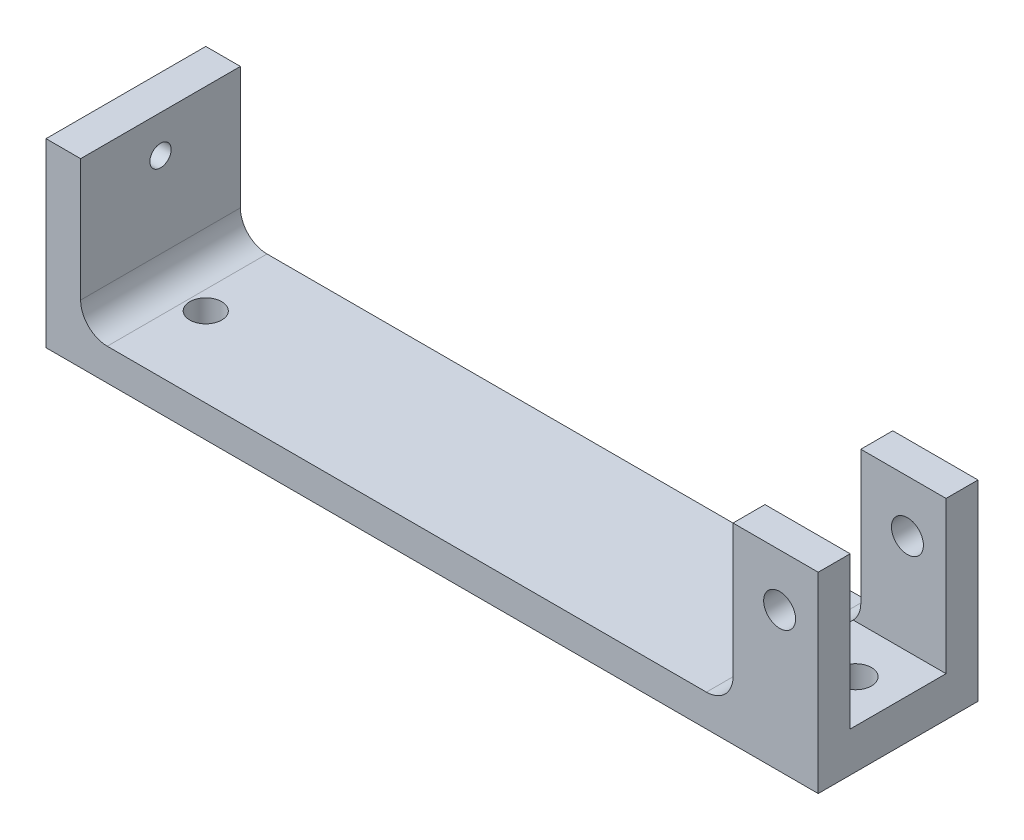
ISO-10303-21;
HEADER;
FILE_DESCRIPTION(('STEP AP214'),'2;1');
FILE_NAME('part.step','',(''),(''),'','','');
FILE_SCHEMA(('AUTOMOTIVE_DESIGN { 1 0 10303 214 1 1 1 1 }'));
ENDSEC;
DATA;
#1=APPLICATION_CONTEXT('core data for automotive mechanical design processes');
#2=APPLICATION_PROTOCOL_DEFINITION('international standard','automotive_design',2000,#1);
#3=PRODUCT_CONTEXT('',#1,'mechanical');
#4=PRODUCT('Part','Part','',(#3));
#5=PRODUCT_RELATED_PRODUCT_CATEGORY('part','',(#4));
#6=PRODUCT_DEFINITION_FORMATION('','',#4);
#7=PRODUCT_DEFINITION_CONTEXT('part definition',#1,'design');
#8=PRODUCT_DEFINITION('design','',#6,#7);
#9=PRODUCT_DEFINITION_SHAPE('','',#8);
#10=(LENGTH_UNIT() NAMED_UNIT(*) SI_UNIT(.MILLI.,.METRE.));
#11=(NAMED_UNIT(*) PLANE_ANGLE_UNIT() SI_UNIT($,.RADIAN.));
#12=(NAMED_UNIT(*) SI_UNIT($,.STERADIAN.) SOLID_ANGLE_UNIT());
#13=UNCERTAINTY_MEASURE_WITH_UNIT(LENGTH_MEASURE(1.E-05),#10,'distance_accuracy_value','');
#14=(GEOMETRIC_REPRESENTATION_CONTEXT(3) GLOBAL_UNCERTAINTY_ASSIGNED_CONTEXT((#13)) GLOBAL_UNIT_ASSIGNED_CONTEXT((#10,
#11,#12)) REPRESENTATION_CONTEXT('',''));
#15=CARTESIAN_POINT('',(0.,0.,0.));
#16=DIRECTION('',(0.,0.,1.));
#17=DIRECTION('',(1.,0.,0.));
#18=AXIS2_PLACEMENT_3D('',#15,#16,#17);
#19=CARTESIAN_POINT('',(56.5,36.,-15.));
#20=DIRECTION('',(-1.,0.,0.));
#21=DIRECTION('',(0.,-1.,0.));
#22=AXIS2_PLACEMENT_3D('',#19,#20,#21);
#23=PLANE('',#22);
#24=DIRECTION('',(0.,0.,1.));
#25=VECTOR('',#24,1.);
#26=CARTESIAN_POINT('',(56.5,11.,15.));
#27=LINE('',#26,#25);
#28=CARTESIAN_POINT('',(56.5,11.,-15.));
#29=VERTEX_POINT('',#28);
#30=CARTESIAN_POINT('',(56.5,11.,-9.));
#31=VERTEX_POINT('',#30);
#32=EDGE_CURVE('E253',#29,#31,#27,.T.);
#33=ORIENTED_EDGE('',*,*,#32,.T.);
#34=DIRECTION('',(0.,1.,0.));
#35=VECTOR('',#34,1.);
#36=CARTESIAN_POINT('',(56.5,36.,-9.));
#37=LINE('',#36,#35);
#38=CARTESIAN_POINT('',(56.5,36.,-9.));
#39=VERTEX_POINT('',#38);
#40=EDGE_CURVE('E175',#31,#39,#37,.T.);
#41=ORIENTED_EDGE('',*,*,#40,.T.);
#42=DIRECTION('',(0.,0.,1.));
#43=VECTOR('',#42,1.);
#44=CARTESIAN_POINT('',(56.5,36.,-15.));
#45=LINE('',#44,#43);
#46=CARTESIAN_POINT('',(56.5,36.,-15.));
#47=VERTEX_POINT('',#46);
#48=EDGE_CURVE('E241',#47,#39,#45,.T.);
#49=ORIENTED_EDGE('',*,*,#48,.F.);
#50=DIRECTION('',(0.,-1.,0.));
#51=VECTOR('',#50,1.);
#52=CARTESIAN_POINT('',(56.5,36.,-15.));
#53=LINE('',#52,#51);
#54=EDGE_CURVE('E228',#47,#29,#53,.T.);
#55=ORIENTED_EDGE('',*,*,#54,.T.);
#56=EDGE_LOOP('',(#33,#41,#49,#55));
#57=FACE_BOUND('',#56,.T.);
#58=ADVANCED_FACE('F35',(#57),#23,.T.);
#59=CARTESIAN_POINT('',(72.5,36.,-15.));
#60=DIRECTION('',(0.,1.,0.));
#61=DIRECTION('',(-1.,0.,0.));
#62=AXIS2_PLACEMENT_3D('',#59,#60,#61);
#63=PLANE('',#62);
#64=ORIENTED_EDGE('',*,*,#48,.T.);
#65=DIRECTION('',(1.,0.,0.));
#66=VECTOR('',#65,1.);
#67=CARTESIAN_POINT('',(0.,36.,-9.));
#68=LINE('',#67,#66);
#69=CARTESIAN_POINT('',(72.5,36.,-9.));
#70=VERTEX_POINT('',#69);
#71=EDGE_CURVE('E171',#39,#70,#68,.T.);
#72=ORIENTED_EDGE('',*,*,#71,.T.);
#73=DIRECTION('',(0.,0.,1.));
#74=VECTOR('',#73,1.);
#75=CARTESIAN_POINT('',(72.5,36.,-15.));
#76=LINE('',#75,#74);
#77=CARTESIAN_POINT('',(72.5,36.,-15.));
#78=VERTEX_POINT('',#77);
#79=EDGE_CURVE('E245',#78,#70,#76,.T.);
#80=ORIENTED_EDGE('',*,*,#79,.F.);
#81=DIRECTION('',(-1.,0.,0.));
#82=VECTOR('',#81,1.);
#83=CARTESIAN_POINT('',(72.5,36.,-15.));
#84=LINE('',#83,#82);
#85=EDGE_CURVE('E225',#78,#47,#84,.T.);
#86=ORIENTED_EDGE('',*,*,#85,.T.);
#87=EDGE_LOOP('',(#64,#72,#80,#86));
#88=FACE_BOUND('',#87,.T.);
#89=ADVANCED_FACE('F319',(#88),#63,.T.);
#90=CARTESIAN_POINT('',(-66.,34.,-15.));
#91=DIRECTION('',(0.,1.,0.));
#92=DIRECTION('',(0.,0.,1.));
#93=AXIS2_PLACEMENT_3D('',#90,#91,#92);
#94=PLANE('',#93);
#95=DIRECTION('',(0.,0.,1.));
#96=VECTOR('',#95,1.);
#97=CARTESIAN_POINT('',(-72.5,34.,-15.));
#98=LINE('',#97,#96);
#99=CARTESIAN_POINT('',(-72.5,34.,-15.));
#100=VERTEX_POINT('',#99);
#101=CARTESIAN_POINT('',(-72.5,34.,15.));
#102=VERTEX_POINT('',#101);
#103=EDGE_CURVE('E236',#100,#102,#98,.T.);
#104=ORIENTED_EDGE('',*,*,#103,.T.);
#105=DIRECTION('',(-1.,0.,0.));
#106=VECTOR('',#105,1.);
#107=CARTESIAN_POINT('',(-66.,34.,15.));
#108=LINE('',#107,#106);
#109=CARTESIAN_POINT('',(-66.,34.,15.));
#110=VERTEX_POINT('',#109);
#111=EDGE_CURVE('E190',#110,#102,#108,.T.);
#112=ORIENTED_EDGE('',*,*,#111,.F.);
#113=DIRECTION('',(0.,0.,1.));
#114=VECTOR('',#113,1.);
#115=CARTESIAN_POINT('',(-66.,34.,-15.));
#116=LINE('',#115,#114);
#117=CARTESIAN_POINT('',(-66.,34.,-15.));
#118=VERTEX_POINT('',#117);
#119=EDGE_CURVE('E237',#118,#110,#116,.T.);
#120=ORIENTED_EDGE('',*,*,#119,.F.);
#121=DIRECTION('',(-1.,0.,0.));
#122=VECTOR('',#121,1.);
#123=CARTESIAN_POINT('',(-66.,34.,-15.));
#124=LINE('',#123,#122);
#125=EDGE_CURVE('E213',#118,#100,#124,.T.);
#126=ORIENTED_EDGE('',*,*,#125,.T.);
#127=EDGE_LOOP('',(#104,#112,#120,#126));
#128=FACE_BOUND('',#127,.T.);
#129=ADVANCED_FACE('F307',(#128),#94,.T.);
#130=CARTESIAN_POINT('',(-66.,5.99999999999999,-15.));
#131=DIRECTION('',(1.,0.,0.));
#132=DIRECTION('',(0.,0.,-1.));
#133=AXIS2_PLACEMENT_3D('',#130,#131,#132);
#134=PLANE('',#133);
#135=CARTESIAN_POINT('',(-66.,27.,0.));
#136=DIRECTION('',(1.,0.,0.));
#137=DIRECTION('',(0.,0.,-1.));
#138=AXIS2_PLACEMENT_3D('',#135,#136,#137);
#139=CIRCLE('',#138,2.);
#140=CARTESIAN_POINT('',(-66.,27.,-2.));
#141=VERTEX_POINT('',#140);
#142=EDGE_CURVE('E382',#141,#141,#139,.T.);
#143=ORIENTED_EDGE('',*,*,#142,.F.);
#144=EDGE_LOOP('',(#143));
#145=FACE_BOUND('',#144,.T.);
#146=DIRECTION('',(0.,1.,0.));
#147=VECTOR('',#146,1.);
#148=CARTESIAN_POINT('',(-66.,5.99999999999999,15.));
#149=LINE('',#148,#147);
#150=CARTESIAN_POINT('',(-66.,11.,15.));
#151=VERTEX_POINT('',#150);
#152=EDGE_CURVE('E211',#151,#110,#149,.T.);
#153=ORIENTED_EDGE('',*,*,#152,.F.);
#154=DIRECTION('',(0.,0.,1.));
#155=VECTOR('',#154,1.);
#156=CARTESIAN_POINT('',(-66.,11.,-15.));
#157=LINE('',#156,#155);
#158=CARTESIAN_POINT('',(-66.,11.,-15.));
#159=VERTEX_POINT('',#158);
#160=EDGE_CURVE('E59',#151,#159,#157,.F.);
#161=ORIENTED_EDGE('',*,*,#160,.T.);
#162=DIRECTION('',(0.,1.,0.));
#163=VECTOR('',#162,1.);
#164=CARTESIAN_POINT('',(-66.,5.99999999999999,-15.));
#165=LINE('',#164,#163);
#166=EDGE_CURVE('E234',#159,#118,#165,.T.);
#167=ORIENTED_EDGE('',*,*,#166,.T.);
#168=ORIENTED_EDGE('',*,*,#119,.T.);
#169=EDGE_LOOP('',(#153,#161,#167,#168));
#170=FACE_BOUND('',#169,.T.);
#171=ADVANCED_FACE('F326',(#145,#170),#134,.T.);
#172=CARTESIAN_POINT('',(56.5,6.,-15.));
#173=DIRECTION('',(0.,1.,0.));
#174=DIRECTION('',(-1.,0.,0.));
#175=AXIS2_PLACEMENT_3D('',#172,#173,#174);
#176=PLANE('',#175);
#177=CARTESIAN_POINT('',(-57.5,5.99999999999999,0.));
#178=DIRECTION('',(0.,1.,0.));
#179=DIRECTION('',(-1.,0.,0.));
#180=AXIS2_PLACEMENT_3D('',#177,#178,#179);
#181=CIRCLE('',#180,3.);
#182=CARTESIAN_POINT('',(-60.5,5.99999999999999,0.));
#183=VERTEX_POINT('',#182);
#184=EDGE_CURVE('E185',#183,#183,#181,.F.);
#185=ORIENTED_EDGE('',*,*,#184,.T.);
#186=EDGE_LOOP('',(#185));
#187=FACE_BOUND('',#186,.T.);
#188=DIRECTION('',(-1.,0.,0.));
#189=VECTOR('',#188,1.);
#190=CARTESIAN_POINT('',(56.5,6.,15.));
#191=LINE('',#190,#189);
#192=CARTESIAN_POINT('',(51.5,6.,15.));
#193=VERTEX_POINT('',#192);
#194=CARTESIAN_POINT('',(-61.,5.99999999999999,15.));
#195=VERTEX_POINT('',#194);
#196=EDGE_CURVE('E208',#193,#195,#191,.T.);
#197=ORIENTED_EDGE('',*,*,#196,.F.);
#198=DIRECTION('',(0.,0.,1.));
#199=VECTOR('',#198,1.);
#200=CARTESIAN_POINT('',(51.5,6.,-15.));
#201=LINE('',#200,#199);
#202=CARTESIAN_POINT('',(51.5,6.,-15.));
#203=VERTEX_POINT('',#202);
#204=EDGE_CURVE('E259',#193,#203,#201,.F.);
#205=ORIENTED_EDGE('',*,*,#204,.T.);
#206=DIRECTION('',(-1.,0.,0.));
#207=VECTOR('',#206,1.);
#208=CARTESIAN_POINT('',(56.5,6.,-15.));
#209=LINE('',#208,#207);
#210=CARTESIAN_POINT('',(-61.,5.99999999999999,-15.));
#211=VERTEX_POINT('',#210);
#212=EDGE_CURVE('E231',#203,#211,#209,.T.);
#213=ORIENTED_EDGE('',*,*,#212,.T.);
#214=DIRECTION('',(0.,0.,1.));
#215=VECTOR('',#214,1.);
#216=CARTESIAN_POINT('',(-61.,5.99999999999999,15.));
#217=LINE('',#216,#215);
#218=EDGE_CURVE('E256',#211,#195,#217,.T.);
#219=ORIENTED_EDGE('',*,*,#218,.T.);
#220=EDGE_LOOP('',(#197,#205,#213,#219));
#221=FACE_BOUND('',#220,.T.);
#222=ADVANCED_FACE('F314',(#187,#221),#176,.T.);
#223=DIRECTION('',(0.,1.,0.));
#224=VECTOR('',#223,1.);
#225=CARTESIAN_POINT('',(56.5,36.,9.00000000000001));
#226=LINE('',#225,#224);
#227=CARTESIAN_POINT('',(56.5,11.,9.00000000000001));
#228=VERTEX_POINT('',#227);
#229=CARTESIAN_POINT('',(56.5,36.,9.00000000000001));
#230=VERTEX_POINT('',#229);
#231=EDGE_CURVE('E179',#228,#230,#226,.T.);
#232=ORIENTED_EDGE('',*,*,#231,.F.);
#233=CARTESIAN_POINT('',(56.5,11.,15.));
#234=VERTEX_POINT('',#233);
#235=EDGE_CURVE('E240',#228,#234,#27,.T.);
#236=ORIENTED_EDGE('',*,*,#235,.T.);
#237=DIRECTION('',(0.,-1.,0.));
#238=VECTOR('',#237,1.);
#239=CARTESIAN_POINT('',(56.5,36.,15.));
#240=LINE('',#239,#238);
#241=CARTESIAN_POINT('',(56.5,36.,15.));
#242=VERTEX_POINT('',#241);
#243=EDGE_CURVE('E205',#242,#234,#240,.T.);
#244=ORIENTED_EDGE('',*,*,#243,.F.);
#245=EDGE_CURVE('E244',#230,#242,#45,.T.);
#246=ORIENTED_EDGE('',*,*,#245,.F.);
#247=EDGE_LOOP('',(#232,#236,#244,#246));
#248=FACE_BOUND('',#247,.T.);
#249=ADVANCED_FACE('F282',(#248),#23,.T.);
#250=DIRECTION('',(1.,0.,0.));
#251=VECTOR('',#250,1.);
#252=CARTESIAN_POINT('',(0.,36.,9.00000000000001));
#253=LINE('',#252,#251);
#254=CARTESIAN_POINT('',(72.5,36.,9.00000000000001));
#255=VERTEX_POINT('',#254);
#256=EDGE_CURVE('E157',#230,#255,#253,.T.);
#257=ORIENTED_EDGE('',*,*,#256,.F.);
#258=ORIENTED_EDGE('',*,*,#245,.T.);
#259=DIRECTION('',(-1.,0.,0.));
#260=VECTOR('',#259,1.);
#261=CARTESIAN_POINT('',(72.5,36.,15.));
#262=LINE('',#261,#260);
#263=CARTESIAN_POINT('',(72.5,36.,15.));
#264=VERTEX_POINT('',#263);
#265=EDGE_CURVE('E202',#264,#242,#262,.T.);
#266=ORIENTED_EDGE('',*,*,#265,.F.);
#267=EDGE_CURVE('E247',#255,#264,#76,.T.);
#268=ORIENTED_EDGE('',*,*,#267,.F.);
#269=EDGE_LOOP('',(#257,#258,#266,#268));
#270=FACE_BOUND('',#269,.T.);
#271=ADVANCED_FACE('F286',(#270),#63,.T.);
#272=CARTESIAN_POINT('',(72.5,0.,-15.));
#273=DIRECTION('',(1.,0.,0.));
#274=DIRECTION('',(0.,0.,-1.));
#275=AXIS2_PLACEMENT_3D('',#272,#273,#274);
#276=PLANE('',#275);
#277=DIRECTION('',(0.,1.,0.));
#278=VECTOR('',#277,1.);
#279=CARTESIAN_POINT('',(72.5,-27.6586333718786,9.00000000000001));
#280=LINE('',#279,#278);
#281=CARTESIAN_POINT('',(72.5,7.5,9.00000000000001));
#282=VERTEX_POINT('',#281);
#283=EDGE_CURVE('E154',#282,#255,#280,.T.);
#284=ORIENTED_EDGE('',*,*,#283,.T.);
#285=ORIENTED_EDGE('',*,*,#267,.T.);
#286=DIRECTION('',(0.,1.,0.));
#287=VECTOR('',#286,1.);
#288=CARTESIAN_POINT('',(72.5,0.,15.));
#289=LINE('',#288,#287);
#290=CARTESIAN_POINT('',(72.5,0.,15.));
#291=VERTEX_POINT('',#290);
#292=EDGE_CURVE('E199',#291,#264,#289,.T.);
#293=ORIENTED_EDGE('',*,*,#292,.F.);
#294=DIRECTION('',(0.,0.,1.));
#295=VECTOR('',#294,1.);
#296=CARTESIAN_POINT('',(72.5,0.,-15.));
#297=LINE('',#296,#295);
#298=CARTESIAN_POINT('',(72.5,0.,-15.));
#299=VERTEX_POINT('',#298);
#300=EDGE_CURVE('E248',#299,#291,#297,.T.);
#301=ORIENTED_EDGE('',*,*,#300,.F.);
#302=DIRECTION('',(0.,1.,0.));
#303=VECTOR('',#302,1.);
#304=CARTESIAN_POINT('',(72.5,0.,-15.));
#305=LINE('',#304,#303);
#306=EDGE_CURVE('E222',#299,#78,#305,.T.);
#307=ORIENTED_EDGE('',*,*,#306,.T.);
#308=ORIENTED_EDGE('',*,*,#79,.T.);
#309=DIRECTION('',(0.,1.,0.));
#310=VECTOR('',#309,1.);
#311=CARTESIAN_POINT('',(72.5,-27.6586333718786,-9.));
#312=LINE('',#311,#310);
#313=CARTESIAN_POINT('',(72.5,7.5,-9.));
#314=VERTEX_POINT('',#313);
#315=EDGE_CURVE('E160',#314,#70,#312,.T.);
#316=ORIENTED_EDGE('',*,*,#315,.F.);
#317=DIRECTION('',(0.,0.,-1.));
#318=VECTOR('',#317,1.);
#319=CARTESIAN_POINT('',(72.5,7.5,0.));
#320=LINE('',#319,#318);
#321=EDGE_CURVE('E146',#282,#314,#320,.T.);
#322=ORIENTED_EDGE('',*,*,#321,.F.);
#323=EDGE_LOOP('',(#284,#285,#293,#301,#307,#308,#316,#322));
#324=FACE_BOUND('',#323,.T.);
#325=ADVANCED_FACE('F162',(#324),#276,.T.);
#326=CARTESIAN_POINT('',(-72.5,0.,-15.));
#327=DIRECTION('',(0.,-1.,0.));
#328=DIRECTION('',(0.,0.,-1.));
#329=AXIS2_PLACEMENT_3D('',#326,#327,#328);
#330=PLANE('',#329);
#331=CARTESIAN_POINT('',(-57.5,0.,0.));
#332=DIRECTION('',(0.,1.,0.));
#333=DIRECTION('',(0.,0.,1.));
#334=AXIS2_PLACEMENT_3D('',#331,#332,#333);
#335=CIRCLE('',#334,3.);
#336=CARTESIAN_POINT('',(-57.5,0.,3.));
#337=VERTEX_POINT('',#336);
#338=EDGE_CURVE('E182',#337,#337,#335,.T.);
#339=ORIENTED_EDGE('',*,*,#338,.T.);
#340=EDGE_LOOP('',(#339));
#341=FACE_BOUND('',#340,.T.);
#342=CARTESIAN_POINT('',(64.5,0.,0.));
#343=DIRECTION('',(0.,1.,0.));
#344=DIRECTION('',(0.,0.,1.));
#345=AXIS2_PLACEMENT_3D('',#342,#343,#344);
#346=CIRCLE('',#345,3.00000000000001);
#347=CARTESIAN_POINT('',(64.5,0.,3.00000000000001));
#348=VERTEX_POINT('',#347);
#349=EDGE_CURVE('E181',#348,#348,#346,.T.);
#350=ORIENTED_EDGE('',*,*,#349,.T.);
#351=EDGE_LOOP('',(#350));
#352=FACE_BOUND('',#351,.T.);
#353=ORIENTED_EDGE('',*,*,#300,.T.);
#354=DIRECTION('',(1.,0.,0.));
#355=VECTOR('',#354,1.);
#356=CARTESIAN_POINT('',(-72.5,0.,15.));
#357=LINE('',#356,#355);
#358=CARTESIAN_POINT('',(-72.5,0.,15.));
#359=VERTEX_POINT('',#358);
#360=EDGE_CURVE('E196',#359,#291,#357,.T.);
#361=ORIENTED_EDGE('',*,*,#360,.F.);
#362=DIRECTION('',(0.,0.,1.));
#363=VECTOR('',#362,1.);
#364=CARTESIAN_POINT('',(-72.5,0.,-15.));
#365=LINE('',#364,#363);
#366=CARTESIAN_POINT('',(-72.5,0.,-15.));
#367=VERTEX_POINT('',#366);
#368=EDGE_CURVE('E250',#367,#359,#365,.T.);
#369=ORIENTED_EDGE('',*,*,#368,.F.);
#370=DIRECTION('',(1.,0.,0.));
#371=VECTOR('',#370,1.);
#372=CARTESIAN_POINT('',(-72.5,0.,-15.));
#373=LINE('',#372,#371);
#374=EDGE_CURVE('E219',#367,#299,#373,.T.);
#375=ORIENTED_EDGE('',*,*,#374,.T.);
#376=EDGE_LOOP('',(#353,#361,#369,#375));
#377=FACE_BOUND('',#376,.T.);
#378=ADVANCED_FACE('F300',(#341,#352,#377),#330,.T.);
#379=CARTESIAN_POINT('',(-72.5,34.,-15.));
#380=DIRECTION('',(-1.,0.,0.));
#381=DIRECTION('',(0.,0.,1.));
#382=AXIS2_PLACEMENT_3D('',#379,#380,#381);
#383=PLANE('',#382);
#384=CARTESIAN_POINT('',(-72.5,27.,0.));
#385=DIRECTION('',(1.,0.,0.));
#386=DIRECTION('',(0.,0.,-1.));
#387=AXIS2_PLACEMENT_3D('',#384,#385,#386);
#388=CIRCLE('',#387,2.);
#389=CARTESIAN_POINT('',(-72.5,27.,-2.));
#390=VERTEX_POINT('',#389);
#391=EDGE_CURVE('E385',#390,#390,#388,.T.);
#392=ORIENTED_EDGE('',*,*,#391,.T.);
#393=EDGE_LOOP('',(#392));
#394=FACE_BOUND('',#393,.T.);
#395=ORIENTED_EDGE('',*,*,#368,.T.);
#396=DIRECTION('',(0.,-1.,0.));
#397=VECTOR('',#396,1.);
#398=CARTESIAN_POINT('',(-72.5,34.,15.));
#399=LINE('',#398,#397);
#400=EDGE_CURVE('E193',#102,#359,#399,.T.);
#401=ORIENTED_EDGE('',*,*,#400,.F.);
#402=ORIENTED_EDGE('',*,*,#103,.F.);
#403=DIRECTION('',(0.,-1.,0.));
#404=VECTOR('',#403,1.);
#405=CARTESIAN_POINT('',(-72.5,34.,-15.));
#406=LINE('',#405,#404);
#407=EDGE_CURVE('E216',#100,#367,#406,.T.);
#408=ORIENTED_EDGE('',*,*,#407,.T.);
#409=EDGE_LOOP('',(#395,#401,#402,#408));
#410=FACE_BOUND('',#409,.T.);
#411=ADVANCED_FACE('F303',(#394,#410),#383,.T.);
#412=CARTESIAN_POINT('',(0.,0.,-15.));
#413=DIRECTION('',(0.,0.,1.));
#414=DIRECTION('',(1.,0.,0.));
#415=AXIS2_PLACEMENT_3D('',#412,#413,#414);
#416=PLANE('',#415);
#417=CARTESIAN_POINT('',(65.25,26.25,-15.));
#418=DIRECTION('',(0.,0.,1.));
#419=DIRECTION('',(1.,0.,0.));
#420=AXIS2_PLACEMENT_3D('',#417,#418,#419);
#421=CIRCLE('',#420,3.00000000000001);
#422=CARTESIAN_POINT('',(68.25,26.25,-15.));
#423=VERTEX_POINT('',#422);
#424=EDGE_CURVE('E393',#423,#423,#421,.T.);
#425=ORIENTED_EDGE('',*,*,#424,.T.);
#426=EDGE_LOOP('',(#425));
#427=FACE_BOUND('',#426,.T.);
#428=ORIENTED_EDGE('',*,*,#125,.F.);
#429=ORIENTED_EDGE('',*,*,#166,.F.);
#430=CARTESIAN_POINT('',(-61.,11.,-15.));
#431=DIRECTION('',(0.,0.,1.));
#432=DIRECTION('',(1.,0.,0.));
#433=AXIS2_PLACEMENT_3D('',#430,#431,#432);
#434=CIRCLE('',#433,5.);
#435=EDGE_CURVE('E268',#159,#211,#434,.T.);
#436=ORIENTED_EDGE('',*,*,#435,.T.);
#437=ORIENTED_EDGE('',*,*,#212,.F.);
#438=CARTESIAN_POINT('',(51.5,11.,-15.));
#439=DIRECTION('',(0.,0.,1.));
#440=DIRECTION('',(1.,0.,0.));
#441=AXIS2_PLACEMENT_3D('',#438,#439,#440);
#442=CIRCLE('',#441,5.);
#443=EDGE_CURVE('E264',#203,#29,#442,.T.);
#444=ORIENTED_EDGE('',*,*,#443,.T.);
#445=ORIENTED_EDGE('',*,*,#54,.F.);
#446=ORIENTED_EDGE('',*,*,#85,.F.);
#447=ORIENTED_EDGE('',*,*,#306,.F.);
#448=ORIENTED_EDGE('',*,*,#374,.F.);
#449=ORIENTED_EDGE('',*,*,#407,.F.);
#450=EDGE_LOOP('',(#428,#429,#436,#437,#444,#445,#446,#447,#448,#449));
#451=FACE_BOUND('',#450,.T.);
#452=ADVANCED_FACE('F297',(#427,#451),#416,.F.);
#453=CARTESIAN_POINT('',(0.,0.,15.));
#454=DIRECTION('',(0.,0.,1.));
#455=DIRECTION('',(1.,0.,0.));
#456=AXIS2_PLACEMENT_3D('',#453,#454,#455);
#457=PLANE('',#456);
#458=CARTESIAN_POINT('',(65.25,26.25,15.));
#459=DIRECTION('',(0.,0.,1.));
#460=DIRECTION('',(1.,0.,0.));
#461=AXIS2_PLACEMENT_3D('',#458,#459,#460);
#462=CIRCLE('',#461,3.00000000000001);
#463=CARTESIAN_POINT('',(68.25,26.25,15.));
#464=VERTEX_POINT('',#463);
#465=EDGE_CURVE('E388',#464,#464,#462,.T.);
#466=ORIENTED_EDGE('',*,*,#465,.F.);
#467=EDGE_LOOP('',(#466));
#468=FACE_BOUND('',#467,.T.);
#469=ORIENTED_EDGE('',*,*,#111,.T.);
#470=ORIENTED_EDGE('',*,*,#400,.T.);
#471=ORIENTED_EDGE('',*,*,#360,.T.);
#472=ORIENTED_EDGE('',*,*,#292,.T.);
#473=ORIENTED_EDGE('',*,*,#265,.T.);
#474=ORIENTED_EDGE('',*,*,#243,.T.);
#475=CARTESIAN_POINT('',(51.5,11.,15.));
#476=DIRECTION('',(0.,0.,1.));
#477=DIRECTION('',(1.,0.,0.));
#478=AXIS2_PLACEMENT_3D('',#475,#476,#477);
#479=CIRCLE('',#478,5.);
#480=EDGE_CURVE('E262',#234,#193,#479,.F.);
#481=ORIENTED_EDGE('',*,*,#480,.T.);
#482=ORIENTED_EDGE('',*,*,#196,.T.);
#483=CARTESIAN_POINT('',(-61.,11.,15.));
#484=DIRECTION('',(0.,0.,1.));
#485=DIRECTION('',(1.,0.,0.));
#486=AXIS2_PLACEMENT_3D('',#483,#484,#485);
#487=CIRCLE('',#486,5.);
#488=EDGE_CURVE('E266',#195,#151,#487,.F.);
#489=ORIENTED_EDGE('',*,*,#488,.T.);
#490=ORIENTED_EDGE('',*,*,#152,.T.);
#491=EDGE_LOOP('',(#469,#470,#471,#472,#473,#474,#481,#482,#489,#490));
#492=FACE_BOUND('',#491,.T.);
#493=ADVANCED_FACE('F288',(#468,#492),#457,.T.);
#494=CARTESIAN_POINT('',(64.5,36.,0.));
#495=DIRECTION('',(0.,-1.,0.));
#496=DIRECTION('',(0.,0.,-1.));
#497=AXIS2_PLACEMENT_3D('',#494,#495,#496);
#498=CYLINDRICAL_SURFACE('',#497,3.00000000000001);
#499=CARTESIAN_POINT('',(64.5,7.5,0.));
#500=DIRECTION('',(0.,-1.,0.));
#501=DIRECTION('',(0.,0.,-1.));
#502=AXIS2_PLACEMENT_3D('',#499,#500,#501);
#503=CIRCLE('',#502,3.00000000000001);
#504=CARTESIAN_POINT('',(64.5,7.5,-3.00000000000001));
#505=VERTEX_POINT('',#504);
#506=EDGE_CURVE('E165',#505,#505,#503,.T.);
#507=ORIENTED_EDGE('',*,*,#506,.F.);
#508=EDGE_LOOP('',(#507));
#509=FACE_BOUND('',#508,.T.);
#510=ORIENTED_EDGE('',*,*,#349,.F.);
#511=EDGE_LOOP('',(#510));
#512=FACE_BOUND('',#511,.T.);
#513=ADVANCED_FACE('F349',(#509,#512),#498,.F.);
#514=CARTESIAN_POINT('',(-57.5,36.,0.));
#515=DIRECTION('',(0.,-1.,0.));
#516=DIRECTION('',(0.,0.,-1.));
#517=AXIS2_PLACEMENT_3D('',#514,#515,#516);
#518=CYLINDRICAL_SURFACE('',#517,3.);
#519=ORIENTED_EDGE('',*,*,#184,.F.);
#520=EDGE_LOOP('',(#519));
#521=FACE_BOUND('',#520,.T.);
#522=ORIENTED_EDGE('',*,*,#338,.F.);
#523=EDGE_LOOP('',(#522));
#524=FACE_BOUND('',#523,.T.);
#525=ADVANCED_FACE('F353',(#521,#524),#518,.F.);
#526=CARTESIAN_POINT('',(51.5,11.,-15.));
#527=DIRECTION('',(0.,0.,-1.));
#528=DIRECTION('',(-1.,0.,0.));
#529=AXIS2_PLACEMENT_3D('',#526,#527,#528);
#530=CYLINDRICAL_SURFACE('',#529,5.);
#531=ORIENTED_EDGE('',*,*,#235,.F.);
#532=CARTESIAN_POINT('',(51.5,11.,9.00000000000001));
#533=DIRECTION('',(0.,0.,1.));
#534=DIRECTION('',(1.,0.,0.));
#535=AXIS2_PLACEMENT_3D('',#532,#533,#534);
#536=CIRCLE('',#535,5.);
#537=CARTESIAN_POINT('',(55.0707142142714,7.5,9.00000000000001));
#538=VERTEX_POINT('',#537);
#539=EDGE_CURVE('E12',#228,#538,#536,.F.);
#540=ORIENTED_EDGE('',*,*,#539,.T.);
#541=DIRECTION('',(0.,0.,-1.));
#542=VECTOR('',#541,1.);
#543=CARTESIAN_POINT('',(55.0707142142714,7.5,-15.));
#544=LINE('',#543,#542);
#545=CARTESIAN_POINT('',(55.0707142142714,7.5,-9.));
#546=VERTEX_POINT('',#545);
#547=EDGE_CURVE('E149',#538,#546,#544,.T.);
#548=ORIENTED_EDGE('',*,*,#547,.T.);
#549=CARTESIAN_POINT('',(51.5,11.,-9.));
#550=DIRECTION('',(0.,0.,1.));
#551=DIRECTION('',(1.,0.,0.));
#552=AXIS2_PLACEMENT_3D('',#549,#550,#551);
#553=CIRCLE('',#552,5.);
#554=EDGE_CURVE('E44',#31,#546,#553,.F.);
#555=ORIENTED_EDGE('',*,*,#554,.F.);
#556=ORIENTED_EDGE('',*,*,#32,.F.);
#557=ORIENTED_EDGE('',*,*,#443,.F.);
#558=ORIENTED_EDGE('',*,*,#204,.F.);
#559=ORIENTED_EDGE('',*,*,#480,.F.);
#560=EDGE_LOOP('',(#531,#540,#548,#555,#556,#557,#558,#559));
#561=FACE_BOUND('',#560,.T.);
#562=ADVANCED_FACE('F277',(#561),#530,.F.);
#563=CARTESIAN_POINT('',(-61.,11.,-15.));
#564=DIRECTION('',(0.,0.,-1.));
#565=DIRECTION('',(-1.,0.,0.));
#566=AXIS2_PLACEMENT_3D('',#563,#564,#565);
#567=CYLINDRICAL_SURFACE('',#566,5.);
#568=ORIENTED_EDGE('',*,*,#435,.F.);
#569=ORIENTED_EDGE('',*,*,#160,.F.);
#570=ORIENTED_EDGE('',*,*,#488,.F.);
#571=ORIENTED_EDGE('',*,*,#218,.F.);
#572=EDGE_LOOP('',(#568,#569,#570,#571));
#573=FACE_BOUND('',#572,.T.);
#574=ADVANCED_FACE('F37',(#573),#567,.F.);
#575=CARTESIAN_POINT('',(-72.5,7.5,-15.));
#576=DIRECTION('',(0.,-1.,0.));
#577=DIRECTION('',(0.,0.,-1.));
#578=AXIS2_PLACEMENT_3D('',#575,#576,#577);
#579=PLANE('',#578);
#580=ORIENTED_EDGE('',*,*,#506,.T.);
#581=EDGE_LOOP('',(#580));
#582=FACE_BOUND('',#581,.T.);
#583=DIRECTION('',(1.,0.,0.));
#584=VECTOR('',#583,1.);
#585=CARTESIAN_POINT('',(0.,7.5,9.00000000000001));
#586=LINE('',#585,#584);
#587=EDGE_CURVE('E142',#538,#282,#586,.T.);
#588=ORIENTED_EDGE('',*,*,#587,.T.);
#589=ORIENTED_EDGE('',*,*,#321,.T.);
#590=DIRECTION('',(1.,0.,0.));
#591=VECTOR('',#590,1.);
#592=CARTESIAN_POINT('',(0.,7.5,-9.));
#593=LINE('',#592,#591);
#594=EDGE_CURVE('E51',#546,#314,#593,.T.);
#595=ORIENTED_EDGE('',*,*,#594,.F.);
#596=ORIENTED_EDGE('',*,*,#547,.F.);
#597=EDGE_LOOP('',(#588,#589,#595,#596));
#598=FACE_BOUND('',#597,.T.);
#599=ADVANCED_FACE('F144',(#582,#598),#579,.F.);
#600=CARTESIAN_POINT('',(0.,-27.6586333718786,9.00000000000001));
#601=DIRECTION('',(0.,0.,1.));
#602=DIRECTION('',(1.,0.,0.));
#603=AXIS2_PLACEMENT_3D('',#600,#601,#602);
#604=PLANE('',#603);
#605=CARTESIAN_POINT('',(65.25,26.25,9.00000000000001));
#606=DIRECTION('',(0.,0.,1.));
#607=DIRECTION('',(1.,0.,0.));
#608=AXIS2_PLACEMENT_3D('',#605,#606,#607);
#609=CIRCLE('',#608,3.00000000000001);
#610=CARTESIAN_POINT('',(68.25,26.25,9.00000000000001));
#611=VERTEX_POINT('',#610);
#612=EDGE_CURVE('E151',#611,#611,#609,.T.);
#613=ORIENTED_EDGE('',*,*,#612,.T.);
#614=EDGE_LOOP('',(#613));
#615=FACE_BOUND('',#614,.T.);
#616=ORIENTED_EDGE('',*,*,#231,.T.);
#617=ORIENTED_EDGE('',*,*,#256,.T.);
#618=ORIENTED_EDGE('',*,*,#283,.F.);
#619=ORIENTED_EDGE('',*,*,#587,.F.);
#620=ORIENTED_EDGE('',*,*,#539,.F.);
#621=EDGE_LOOP('',(#616,#617,#618,#619,#620));
#622=FACE_BOUND('',#621,.T.);
#623=ADVANCED_FACE('F155',(#615,#622),#604,.F.);
#624=CARTESIAN_POINT('',(0.,-27.6586333718786,-9.));
#625=DIRECTION('',(0.,0.,1.));
#626=DIRECTION('',(1.,0.,0.));
#627=AXIS2_PLACEMENT_3D('',#624,#625,#626);
#628=PLANE('',#627);
#629=CARTESIAN_POINT('',(65.25,26.25,-9.));
#630=DIRECTION('',(0.,0.,1.));
#631=DIRECTION('',(1.,0.,0.));
#632=AXIS2_PLACEMENT_3D('',#629,#630,#631);
#633=CIRCLE('',#632,3.00000000000001);
#634=CARTESIAN_POINT('',(68.25,26.25,-9.));
#635=VERTEX_POINT('',#634);
#636=EDGE_CURVE('E39',#635,#635,#633,.T.);
#637=ORIENTED_EDGE('',*,*,#636,.F.);
#638=EDGE_LOOP('',(#637));
#639=FACE_BOUND('',#638,.T.);
#640=ORIENTED_EDGE('',*,*,#554,.T.);
#641=ORIENTED_EDGE('',*,*,#594,.T.);
#642=ORIENTED_EDGE('',*,*,#315,.T.);
#643=ORIENTED_EDGE('',*,*,#71,.F.);
#644=ORIENTED_EDGE('',*,*,#40,.F.);
#645=EDGE_LOOP('',(#640,#641,#642,#643,#644));
#646=FACE_BOUND('',#645,.T.);
#647=ADVANCED_FACE('F273',(#639,#646),#628,.T.);
#648=CARTESIAN_POINT('',(65.25,26.25,-15.));
#649=DIRECTION('',(0.,0.,1.));
#650=DIRECTION('',(1.,0.,0.));
#651=AXIS2_PLACEMENT_3D('',#648,#649,#650);
#652=CYLINDRICAL_SURFACE('',#651,3.00000000000001);
#653=ORIENTED_EDGE('',*,*,#636,.T.);
#654=EDGE_LOOP('',(#653));
#655=FACE_BOUND('',#654,.T.);
#656=ORIENTED_EDGE('',*,*,#424,.F.);
#657=EDGE_LOOP('',(#656));
#658=FACE_BOUND('',#657,.T.);
#659=ADVANCED_FACE('F360',(#655,#658),#652,.F.);
#660=ORIENTED_EDGE('',*,*,#465,.T.);
#661=EDGE_LOOP('',(#660));
#662=FACE_BOUND('',#661,.T.);
#663=ORIENTED_EDGE('',*,*,#612,.F.);
#664=EDGE_LOOP('',(#663));
#665=FACE_BOUND('',#664,.T.);
#666=ADVANCED_FACE('F370',(#662,#665),#652,.F.);
#667=CARTESIAN_POINT('',(-72.5,27.,0.));
#668=DIRECTION('',(1.,0.,0.));
#669=DIRECTION('',(0.,0.,-1.));
#670=AXIS2_PLACEMENT_3D('',#667,#668,#669);
#671=CYLINDRICAL_SURFACE('',#670,2.);
#672=ORIENTED_EDGE('',*,*,#142,.T.);
#673=EDGE_LOOP('',(#672));
#674=FACE_BOUND('',#673,.T.);
#675=ORIENTED_EDGE('',*,*,#391,.F.);
#676=EDGE_LOOP('',(#675));
#677=FACE_BOUND('',#676,.T.);
#678=ADVANCED_FACE('F372',(#674,#677),#671,.F.);
#679=CLOSED_SHELL('',(#58,#89,#129,#171,#222,#249,#271,#325,#378,#411,#452,#493,#513,#525,#562,
#574,#599,#623,#647,#659,#666,#678));
#680=MANIFOLD_SOLID_BREP('B2',#679);
#681=ADVANCED_BREP_SHAPE_REPRESENTATION('',(#18,#680),#14);
#682=SHAPE_DEFINITION_REPRESENTATION(#9,#681);
ENDSEC;
END-ISO-10303-21;
